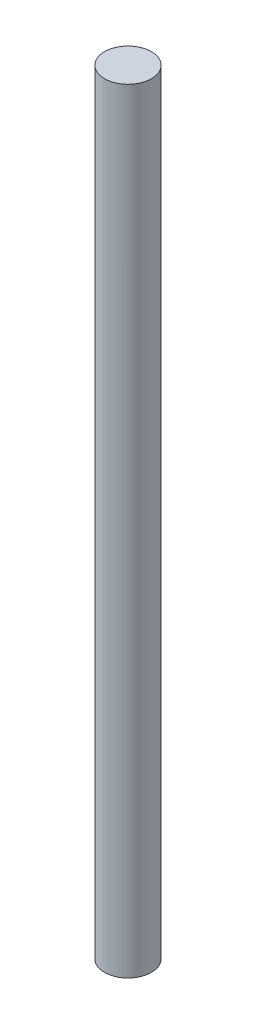
ISO-10303-21;
HEADER;
FILE_DESCRIPTION(('STEP AP214'),'2;1');
FILE_NAME('part.step','',(''),(''),'','','');
FILE_SCHEMA(('AUTOMOTIVE_DESIGN { 1 0 10303 214 1 1 1 1 }'));
ENDSEC;
DATA;
#1=APPLICATION_CONTEXT('core data for automotive mechanical design processes');
#2=APPLICATION_PROTOCOL_DEFINITION('international standard','automotive_design',2000,#1);
#3=PRODUCT_CONTEXT('',#1,'mechanical');
#4=PRODUCT('Part','Part','',(#3));
#5=PRODUCT_RELATED_PRODUCT_CATEGORY('part','',(#4));
#6=PRODUCT_DEFINITION_FORMATION('','',#4);
#7=PRODUCT_DEFINITION_CONTEXT('part definition',#1,'design');
#8=PRODUCT_DEFINITION('design','',#6,#7);
#9=PRODUCT_DEFINITION_SHAPE('','',#8);
#10=(LENGTH_UNIT() NAMED_UNIT(*) SI_UNIT(.MILLI.,.METRE.));
#11=(NAMED_UNIT(*) PLANE_ANGLE_UNIT() SI_UNIT($,.RADIAN.));
#12=(NAMED_UNIT(*) SI_UNIT($,.STERADIAN.) SOLID_ANGLE_UNIT());
#13=UNCERTAINTY_MEASURE_WITH_UNIT(LENGTH_MEASURE(1.E-05),#10,'distance_accuracy_value','');
#14=(GEOMETRIC_REPRESENTATION_CONTEXT(3) GLOBAL_UNCERTAINTY_ASSIGNED_CONTEXT((#13)) GLOBAL_UNIT_ASSIGNED_CONTEXT((#10,
#11,#12)) REPRESENTATION_CONTEXT('',''));
#15=CARTESIAN_POINT('',(0.,0.,0.));
#16=DIRECTION('',(0.,0.,1.));
#17=DIRECTION('',(1.,0.,0.));
#18=AXIS2_PLACEMENT_3D('',#15,#16,#17);
#19=CARTESIAN_POINT('',(0.,95.7775,18.));
#20=DIRECTION('',(0.,1.,0.));
#21=DIRECTION('',(0.,0.,1.));
#22=AXIS2_PLACEMENT_3D('',#19,#20,#21);
#23=CYLINDRICAL_SURFACE('',#22,5.);
#24=CARTESIAN_POINT('',(0.,190.,18.));
#25=DIRECTION('',(0.,1.,0.));
#26=DIRECTION('',(0.,0.,1.));
#27=AXIS2_PLACEMENT_3D('',#24,#25,#26);
#28=CIRCLE('',#27,5.);
#29=CARTESIAN_POINT('',(0.,190.,23.));
#30=VERTEX_POINT('',#29);
#31=EDGE_CURVE('E10',#30,#30,#28,.F.);
#32=ORIENTED_EDGE('',*,*,#31,.T.);
#33=EDGE_LOOP('',(#32));
#34=FACE_BOUND('',#33,.T.);
#35=CARTESIAN_POINT('',(0.,25.,18.));
#36=DIRECTION('',(0.,-1.,0.));
#37=DIRECTION('',(0.,0.,-1.));
#38=AXIS2_PLACEMENT_3D('',#35,#36,#37);
#39=CIRCLE('',#38,4.99999999999545);
#40=CARTESIAN_POINT('',(0.,25.,13.0000000000045));
#41=VERTEX_POINT('',#40);
#42=EDGE_CURVE('E41',#41,#41,#39,.T.);
#43=ORIENTED_EDGE('',*,*,#42,.F.);
#44=EDGE_LOOP('',(#43));
#45=FACE_BOUND('',#44,.T.);
#46=ADVANCED_FACE('F34',(#34,#45),#23,.T.);
#47=CARTESIAN_POINT('',(2.5,190.,18.));
#48=DIRECTION('',(0.,1.,0.));
#49=DIRECTION('',(0.,0.,1.));
#50=AXIS2_PLACEMENT_3D('',#47,#48,#49);
#51=PLANE('',#50);
#52=ORIENTED_EDGE('',*,*,#31,.F.);
#53=EDGE_LOOP('',(#52));
#54=FACE_BOUND('',#53,.T.);
#55=ADVANCED_FACE('F36',(#54),#51,.T.);
#56=CARTESIAN_POINT('',(0.,25.,18.));
#57=DIRECTION('',(0.,-1.,0.));
#58=DIRECTION('',(0.,0.,-1.));
#59=AXIS2_PLACEMENT_3D('',#56,#57,#58);
#60=PLANE('',#59);
#61=ORIENTED_EDGE('',*,*,#42,.T.);
#62=EDGE_LOOP('',(#61));
#63=FACE_BOUND('',#62,.T.);
#64=ADVANCED_FACE('F47',(#63),#60,.T.);
#65=CLOSED_SHELL('',(#46,#55,#64));
#66=MANIFOLD_SOLID_BREP('B2',#65);
#67=ADVANCED_BREP_SHAPE_REPRESENTATION('',(#18,#66),#14);
#68=SHAPE_DEFINITION_REPRESENTATION(#9,#67);
ENDSEC;
END-ISO-10303-21;
